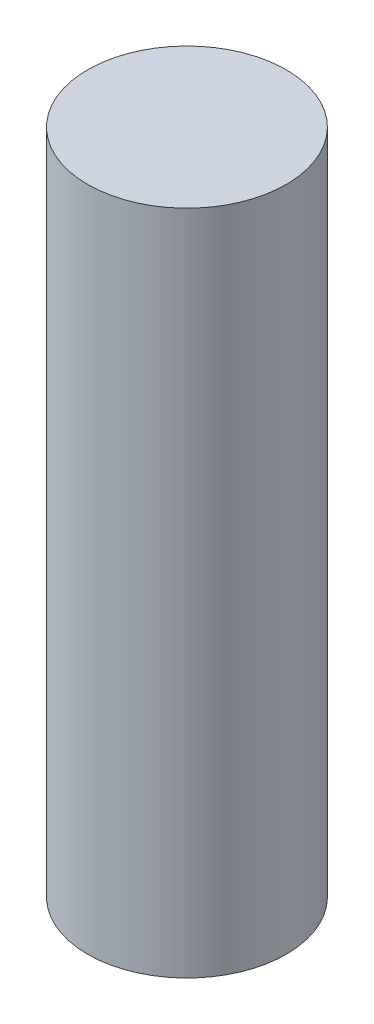
ISO-10303-21;
HEADER;
FILE_DESCRIPTION(('STEP AP214'),'2;1');
FILE_NAME('part.step','',(''),(''),'','','');
FILE_SCHEMA(('AUTOMOTIVE_DESIGN { 1 0 10303 214 1 1 1 1 }'));
ENDSEC;
DATA;
#1=APPLICATION_CONTEXT('core data for automotive mechanical design processes');
#2=APPLICATION_PROTOCOL_DEFINITION('international standard','automotive_design',2000,#1);
#3=PRODUCT_CONTEXT('',#1,'mechanical');
#4=PRODUCT('Part','Part','',(#3));
#5=PRODUCT_RELATED_PRODUCT_CATEGORY('part','',(#4));
#6=PRODUCT_DEFINITION_FORMATION('','',#4);
#7=PRODUCT_DEFINITION_CONTEXT('part definition',#1,'design');
#8=PRODUCT_DEFINITION('design','',#6,#7);
#9=PRODUCT_DEFINITION_SHAPE('','',#8);
#10=(LENGTH_UNIT() NAMED_UNIT(*) SI_UNIT(.MILLI.,.METRE.));
#11=(NAMED_UNIT(*) PLANE_ANGLE_UNIT() SI_UNIT($,.RADIAN.));
#12=(NAMED_UNIT(*) SI_UNIT($,.STERADIAN.) SOLID_ANGLE_UNIT());
#13=UNCERTAINTY_MEASURE_WITH_UNIT(LENGTH_MEASURE(1.E-05),#10,'distance_accuracy_value','');
#14=(GEOMETRIC_REPRESENTATION_CONTEXT(3) GLOBAL_UNCERTAINTY_ASSIGNED_CONTEXT((#13)) GLOBAL_UNIT_ASSIGNED_CONTEXT((#10,
#11,#12)) REPRESENTATION_CONTEXT('',''));
#15=CARTESIAN_POINT('',(0.,0.,0.));
#16=DIRECTION('',(0.,0.,1.));
#17=DIRECTION('',(1.,0.,0.));
#18=AXIS2_PLACEMENT_3D('',#15,#16,#17);
#19=CARTESIAN_POINT('',(0.,10.,0.));
#20=DIRECTION('',(0.,-1.,0.));
#21=DIRECTION('',(0.,0.,-1.));
#22=AXIS2_PLACEMENT_3D('',#19,#20,#21);
#23=CYLINDRICAL_SURFACE('',#22,1.49);
#24=CARTESIAN_POINT('',(0.,10.,0.));
#25=DIRECTION('',(0.,1.,0.));
#26=DIRECTION('',(0.,0.,1.));
#27=AXIS2_PLACEMENT_3D('',#24,#25,#26);
#28=CIRCLE('',#27,1.49);
#29=CARTESIAN_POINT('',(0.,10.,1.49));
#30=VERTEX_POINT('',#29);
#31=EDGE_CURVE('E10',#30,#30,#28,.T.);
#32=ORIENTED_EDGE('',*,*,#31,.F.);
#33=EDGE_LOOP('',(#32));
#34=FACE_BOUND('',#33,.T.);
#35=CARTESIAN_POINT('',(0.,0.,0.));
#36=DIRECTION('',(0.,1.,0.));
#37=DIRECTION('',(0.,0.,1.));
#38=AXIS2_PLACEMENT_3D('',#35,#36,#37);
#39=CIRCLE('',#38,1.49);
#40=CARTESIAN_POINT('',(0.,0.,1.49));
#41=VERTEX_POINT('',#40);
#42=EDGE_CURVE('E34',#41,#41,#39,.T.);
#43=ORIENTED_EDGE('',*,*,#42,.T.);
#44=EDGE_LOOP('',(#43));
#45=FACE_BOUND('',#44,.T.);
#46=ADVANCED_FACE('F31',(#34,#45),#23,.T.);
#47=CARTESIAN_POINT('',(0.,10.,0.));
#48=DIRECTION('',(0.,1.,0.));
#49=DIRECTION('',(0.,0.,1.));
#50=AXIS2_PLACEMENT_3D('',#47,#48,#49);
#51=PLANE('',#50);
#52=ORIENTED_EDGE('',*,*,#31,.T.);
#53=EDGE_LOOP('',(#52));
#54=FACE_BOUND('',#53,.T.);
#55=ADVANCED_FACE('F46',(#54),#51,.T.);
#56=CARTESIAN_POINT('',(0.,0.,0.));
#57=DIRECTION('',(0.,1.,0.));
#58=DIRECTION('',(0.,0.,1.));
#59=AXIS2_PLACEMENT_3D('',#56,#57,#58);
#60=PLANE('',#59);
#61=ORIENTED_EDGE('',*,*,#42,.F.);
#62=EDGE_LOOP('',(#61));
#63=FACE_BOUND('',#62,.T.);
#64=ADVANCED_FACE('F44',(#63),#60,.F.);
#65=CLOSED_SHELL('',(#46,#55,#64));
#66=MANIFOLD_SOLID_BREP('B2',#65);
#67=ADVANCED_BREP_SHAPE_REPRESENTATION('',(#18,#66),#14);
#68=SHAPE_DEFINITION_REPRESENTATION(#9,#67);
ENDSEC;
END-ISO-10303-21;
